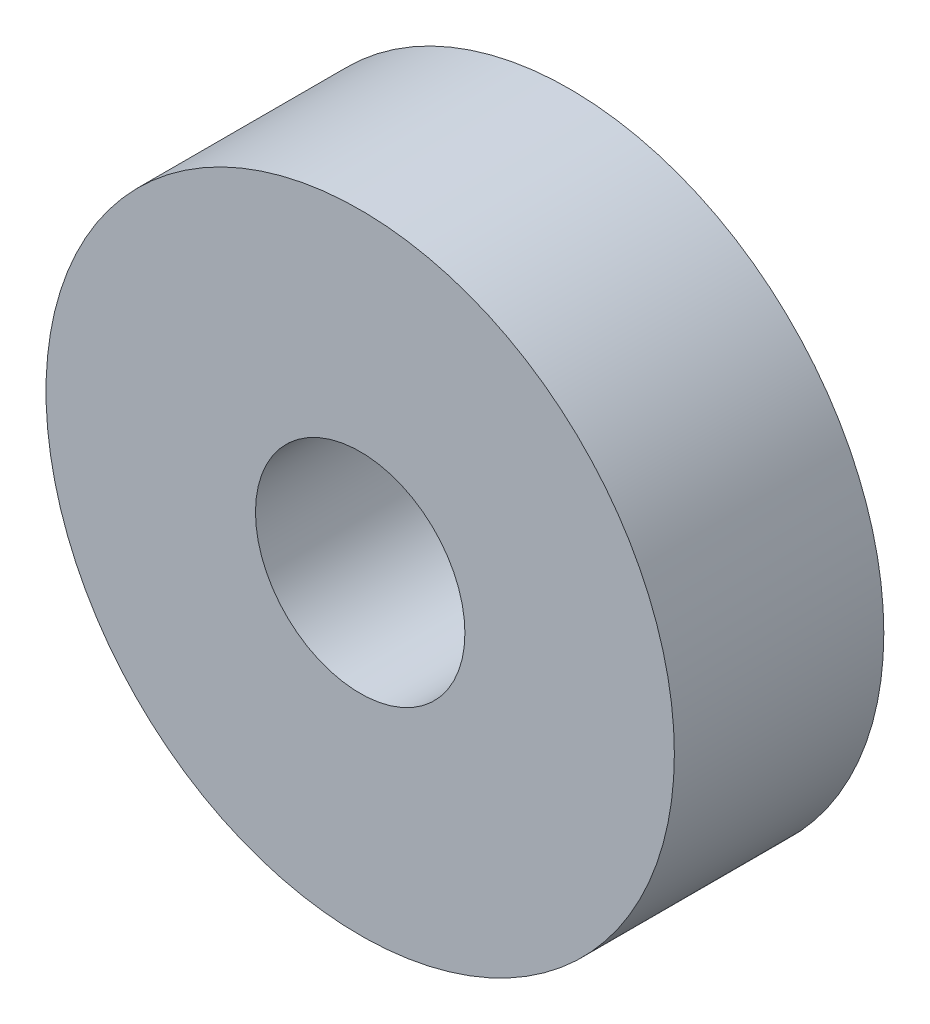
ISO-10303-21;
HEADER;
FILE_DESCRIPTION(('STEP AP214'),'2;1');
FILE_NAME('part.step','',(''),(''),'','','');
FILE_SCHEMA(('AUTOMOTIVE_DESIGN { 1 0 10303 214 1 1 1 1 }'));
ENDSEC;
DATA;
#1=APPLICATION_CONTEXT('core data for automotive mechanical design processes');
#2=APPLICATION_PROTOCOL_DEFINITION('international standard','automotive_design',2000,#1);
#3=PRODUCT_CONTEXT('',#1,'mechanical');
#4=PRODUCT('Part','Part','',(#3));
#5=PRODUCT_RELATED_PRODUCT_CATEGORY('part','',(#4));
#6=PRODUCT_DEFINITION_FORMATION('','',#4);
#7=PRODUCT_DEFINITION_CONTEXT('part definition',#1,'design');
#8=PRODUCT_DEFINITION('design','',#6,#7);
#9=PRODUCT_DEFINITION_SHAPE('','',#8);
#10=(LENGTH_UNIT() NAMED_UNIT(*) SI_UNIT(.MILLI.,.METRE.));
#11=(NAMED_UNIT(*) PLANE_ANGLE_UNIT() SI_UNIT($,.RADIAN.));
#12=(NAMED_UNIT(*) SI_UNIT($,.STERADIAN.) SOLID_ANGLE_UNIT());
#13=UNCERTAINTY_MEASURE_WITH_UNIT(LENGTH_MEASURE(1.E-05),#10,'distance_accuracy_value','');
#14=(GEOMETRIC_REPRESENTATION_CONTEXT(3) GLOBAL_UNCERTAINTY_ASSIGNED_CONTEXT((#13)) GLOBAL_UNIT_ASSIGNED_CONTEXT((#10,
#11,#12)) REPRESENTATION_CONTEXT('',''));
#15=CARTESIAN_POINT('',(0.,0.,0.));
#16=DIRECTION('',(0.,0.,1.));
#17=DIRECTION('',(1.,0.,0.));
#18=AXIS2_PLACEMENT_3D('',#15,#16,#17);
#19=CARTESIAN_POINT('',(0.,0.,8.));
#20=DIRECTION('',(0.,0.,1.));
#21=DIRECTION('',(1.,0.,0.));
#22=AXIS2_PLACEMENT_3D('',#19,#20,#21);
#23=PLANE('',#22);
#24=CARTESIAN_POINT('',(0.,0.,8.));
#25=DIRECTION('',(0.,0.,1.));
#26=DIRECTION('',(1.,0.,0.));
#27=AXIS2_PLACEMENT_3D('',#24,#25,#26);
#28=CIRCLE('',#27,12.);
#29=CARTESIAN_POINT('',(12.,0.,8.));
#30=VERTEX_POINT('',#29);
#31=EDGE_CURVE('E10',#30,#30,#28,.T.);
#32=ORIENTED_EDGE('',*,*,#31,.T.);
#33=EDGE_LOOP('',(#32));
#34=FACE_BOUND('',#33,.T.);
#35=CARTESIAN_POINT('',(0.,0.,8.));
#36=DIRECTION('',(0.,0.,1.));
#37=DIRECTION('',(1.,0.,0.));
#38=AXIS2_PLACEMENT_3D('',#35,#36,#37);
#39=CIRCLE('',#38,4.);
#40=CARTESIAN_POINT('',(4.,0.,8.));
#41=VERTEX_POINT('',#40);
#42=EDGE_CURVE('E42',#41,#41,#39,.T.);
#43=ORIENTED_EDGE('',*,*,#42,.F.);
#44=EDGE_LOOP('',(#43));
#45=FACE_BOUND('',#44,.T.);
#46=ADVANCED_FACE('F31',(#34,#45),#23,.T.);
#47=CARTESIAN_POINT('',(0.,0.,0.));
#48=DIRECTION('',(0.,0.,1.));
#49=DIRECTION('',(1.,0.,0.));
#50=AXIS2_PLACEMENT_3D('',#47,#48,#49);
#51=PLANE('',#50);
#52=CARTESIAN_POINT('',(0.,0.,0.));
#53=DIRECTION('',(0.,0.,1.));
#54=DIRECTION('',(1.,0.,0.));
#55=AXIS2_PLACEMENT_3D('',#52,#53,#54);
#56=CIRCLE('',#55,12.);
#57=CARTESIAN_POINT('',(12.,0.,0.));
#58=VERTEX_POINT('',#57);
#59=EDGE_CURVE('E38',#58,#58,#56,.T.);
#60=ORIENTED_EDGE('',*,*,#59,.F.);
#61=EDGE_LOOP('',(#60));
#62=FACE_BOUND('',#61,.T.);
#63=CARTESIAN_POINT('',(0.,0.,0.));
#64=DIRECTION('',(0.,0.,1.));
#65=DIRECTION('',(1.,0.,0.));
#66=AXIS2_PLACEMENT_3D('',#63,#64,#65);
#67=CIRCLE('',#66,4.);
#68=CARTESIAN_POINT('',(4.,0.,0.));
#69=VERTEX_POINT('',#68);
#70=EDGE_CURVE('E46',#69,#69,#67,.T.);
#71=ORIENTED_EDGE('',*,*,#70,.T.);
#72=EDGE_LOOP('',(#71));
#73=FACE_BOUND('',#72,.T.);
#74=ADVANCED_FACE('F52',(#62,#73),#51,.F.);
#75=CARTESIAN_POINT('',(0.,0.,8.));
#76=DIRECTION('',(0.,0.,-1.));
#77=DIRECTION('',(-1.,0.,0.));
#78=AXIS2_PLACEMENT_3D('',#75,#76,#77);
#79=CYLINDRICAL_SURFACE('',#78,12.);
#80=ORIENTED_EDGE('',*,*,#31,.F.);
#81=EDGE_LOOP('',(#80));
#82=FACE_BOUND('',#81,.T.);
#83=ORIENTED_EDGE('',*,*,#59,.T.);
#84=EDGE_LOOP('',(#83));
#85=FACE_BOUND('',#84,.T.);
#86=ADVANCED_FACE('F33',(#82,#85),#79,.T.);
#87=CARTESIAN_POINT('',(0.,0.,8.));
#88=DIRECTION('',(0.,0.,-1.));
#89=DIRECTION('',(-1.,0.,0.));
#90=AXIS2_PLACEMENT_3D('',#87,#88,#89);
#91=CYLINDRICAL_SURFACE('',#90,4.);
#92=ORIENTED_EDGE('',*,*,#42,.T.);
#93=EDGE_LOOP('',(#92));
#94=FACE_BOUND('',#93,.T.);
#95=ORIENTED_EDGE('',*,*,#70,.F.);
#96=EDGE_LOOP('',(#95));
#97=FACE_BOUND('',#96,.T.);
#98=ADVANCED_FACE('F54',(#94,#97),#91,.F.);
#99=CLOSED_SHELL('',(#46,#74,#86,#98));
#100=MANIFOLD_SOLID_BREP('B2',#99);
#101=ADVANCED_BREP_SHAPE_REPRESENTATION('',(#18,#100),#14);
#102=SHAPE_DEFINITION_REPRESENTATION(#9,#101);
ENDSEC;
END-ISO-10303-21;
